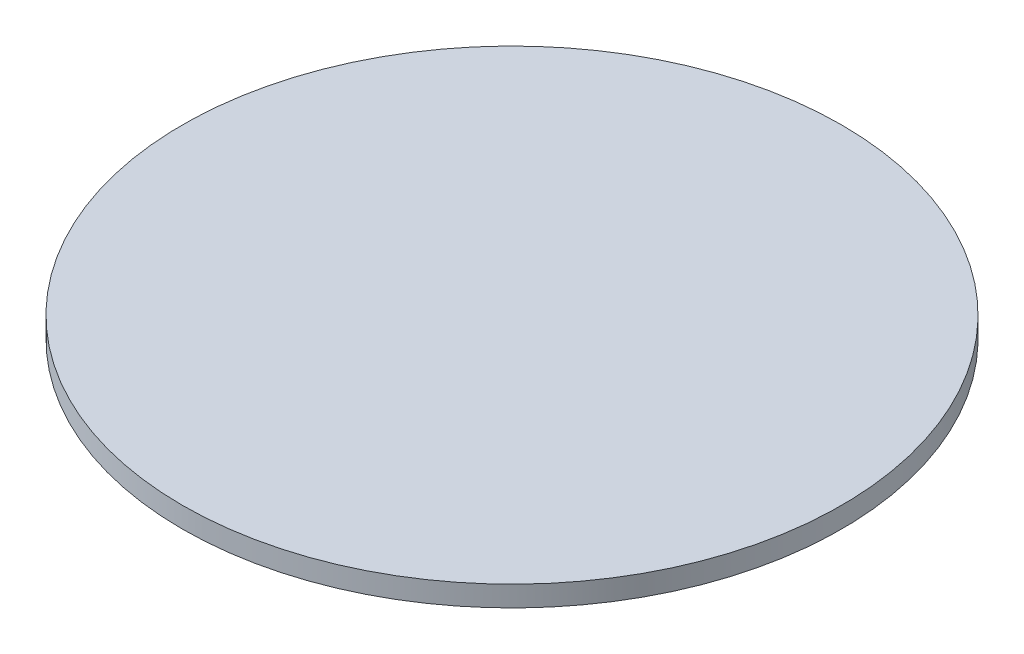
ISO-10303-21;
HEADER;
FILE_DESCRIPTION(('STEP AP214'),'2;1');
FILE_NAME('part.step','',(''),(''),'','','');
FILE_SCHEMA(('AUTOMOTIVE_DESIGN { 1 0 10303 214 1 1 1 1 }'));
ENDSEC;
DATA;
#1=APPLICATION_CONTEXT('core data for automotive mechanical design processes');
#2=APPLICATION_PROTOCOL_DEFINITION('international standard','automotive_design',2000,#1);
#3=PRODUCT_CONTEXT('',#1,'mechanical');
#4=PRODUCT('Part','Part','',(#3));
#5=PRODUCT_RELATED_PRODUCT_CATEGORY('part','',(#4));
#6=PRODUCT_DEFINITION_FORMATION('','',#4);
#7=PRODUCT_DEFINITION_CONTEXT('part definition',#1,'design');
#8=PRODUCT_DEFINITION('design','',#6,#7);
#9=PRODUCT_DEFINITION_SHAPE('','',#8);
#10=(LENGTH_UNIT() NAMED_UNIT(*) SI_UNIT(.MILLI.,.METRE.));
#11=(NAMED_UNIT(*) PLANE_ANGLE_UNIT() SI_UNIT($,.RADIAN.));
#12=(NAMED_UNIT(*) SI_UNIT($,.STERADIAN.) SOLID_ANGLE_UNIT());
#13=UNCERTAINTY_MEASURE_WITH_UNIT(LENGTH_MEASURE(1.E-05),#10,'distance_accuracy_value','');
#14=(GEOMETRIC_REPRESENTATION_CONTEXT(3) GLOBAL_UNCERTAINTY_ASSIGNED_CONTEXT((#13)) GLOBAL_UNIT_ASSIGNED_CONTEXT((#10,
#11,#12)) REPRESENTATION_CONTEXT('',''));
#15=CARTESIAN_POINT('',(0.,0.,0.));
#16=DIRECTION('',(0.,0.,1.));
#17=DIRECTION('',(1.,0.,0.));
#18=AXIS2_PLACEMENT_3D('',#15,#16,#17);
#19=CARTESIAN_POINT('',(0.,6.35,0.));
#20=DIRECTION('',(0.,-1.,0.));
#21=DIRECTION('',(0.,0.,-1.));
#22=AXIS2_PLACEMENT_3D('',#19,#20,#21);
#23=CYLINDRICAL_SURFACE('',#22,101.6);
#24=CARTESIAN_POINT('',(0.,6.35,0.));
#25=DIRECTION('',(0.,1.,0.));
#26=DIRECTION('',(0.,0.,1.));
#27=AXIS2_PLACEMENT_3D('',#24,#25,#26);
#28=CIRCLE('',#27,101.6);
#29=CARTESIAN_POINT('',(0.,6.35,101.6));
#30=VERTEX_POINT('',#29);
#31=EDGE_CURVE('E10',#30,#30,#28,.T.);
#32=ORIENTED_EDGE('',*,*,#31,.F.);
#33=EDGE_LOOP('',(#32));
#34=FACE_BOUND('',#33,.T.);
#35=CARTESIAN_POINT('',(0.,0.,0.));
#36=DIRECTION('',(0.,1.,0.));
#37=DIRECTION('',(0.,0.,1.));
#38=AXIS2_PLACEMENT_3D('',#35,#36,#37);
#39=CIRCLE('',#38,101.6);
#40=CARTESIAN_POINT('',(0.,0.,101.6));
#41=VERTEX_POINT('',#40);
#42=EDGE_CURVE('E34',#41,#41,#39,.T.);
#43=ORIENTED_EDGE('',*,*,#42,.T.);
#44=EDGE_LOOP('',(#43));
#45=FACE_BOUND('',#44,.T.);
#46=ADVANCED_FACE('F31',(#34,#45),#23,.T.);
#47=CARTESIAN_POINT('',(0.,6.35,0.));
#48=DIRECTION('',(0.,1.,0.));
#49=DIRECTION('',(0.,0.,1.));
#50=AXIS2_PLACEMENT_3D('',#47,#48,#49);
#51=PLANE('',#50);
#52=ORIENTED_EDGE('',*,*,#31,.T.);
#53=EDGE_LOOP('',(#52));
#54=FACE_BOUND('',#53,.T.);
#55=ADVANCED_FACE('F46',(#54),#51,.T.);
#56=CARTESIAN_POINT('',(0.,0.,0.));
#57=DIRECTION('',(0.,1.,0.));
#58=DIRECTION('',(0.,0.,1.));
#59=AXIS2_PLACEMENT_3D('',#56,#57,#58);
#60=PLANE('',#59);
#61=ORIENTED_EDGE('',*,*,#42,.F.);
#62=EDGE_LOOP('',(#61));
#63=FACE_BOUND('',#62,.T.);
#64=ADVANCED_FACE('F44',(#63),#60,.F.);
#65=CLOSED_SHELL('',(#46,#55,#64));
#66=MANIFOLD_SOLID_BREP('B2',#65);
#67=ADVANCED_BREP_SHAPE_REPRESENTATION('',(#18,#66),#14);
#68=SHAPE_DEFINITION_REPRESENTATION(#9,#67);
ENDSEC;
END-ISO-10303-21;
